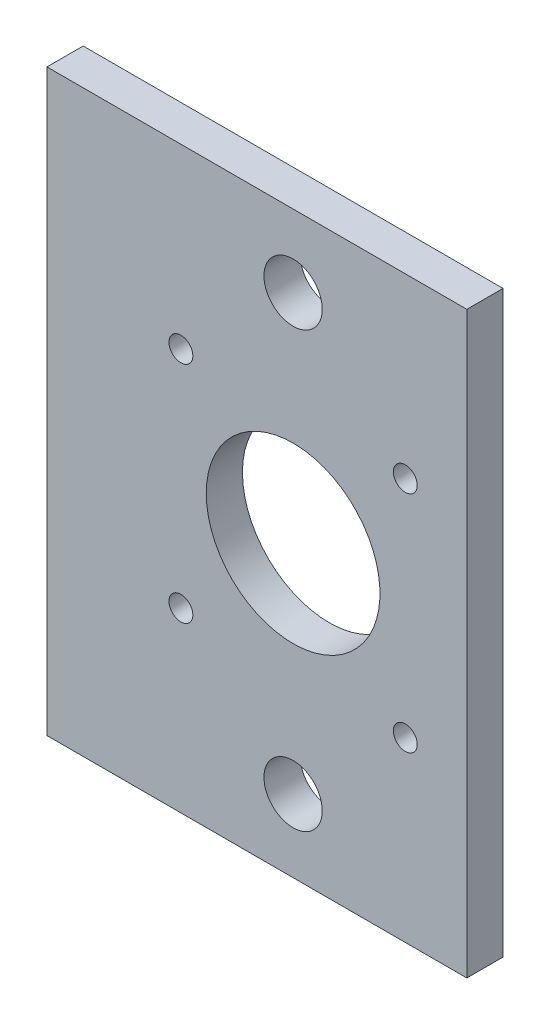
ISO-10303-21;
HEADER;
FILE_DESCRIPTION(('STEP AP214'),'2;1');
FILE_NAME('part.step','',(''),(''),'','','');
FILE_SCHEMA(('AUTOMOTIVE_DESIGN { 1 0 10303 214 1 1 1 1 }'));
ENDSEC;
DATA;
#1=APPLICATION_CONTEXT('core data for automotive mechanical design processes');
#2=APPLICATION_PROTOCOL_DEFINITION('international standard','automotive_design',2000,#1);
#3=PRODUCT_CONTEXT('',#1,'mechanical');
#4=PRODUCT('Part','Part','',(#3));
#5=PRODUCT_RELATED_PRODUCT_CATEGORY('part','',(#4));
#6=PRODUCT_DEFINITION_FORMATION('','',#4);
#7=PRODUCT_DEFINITION_CONTEXT('part definition',#1,'design');
#8=PRODUCT_DEFINITION('design','',#6,#7);
#9=PRODUCT_DEFINITION_SHAPE('','',#8);
#10=(LENGTH_UNIT() NAMED_UNIT(*) SI_UNIT(.MILLI.,.METRE.));
#11=(NAMED_UNIT(*) PLANE_ANGLE_UNIT() SI_UNIT($,.RADIAN.));
#12=(NAMED_UNIT(*) SI_UNIT($,.STERADIAN.) SOLID_ANGLE_UNIT());
#13=UNCERTAINTY_MEASURE_WITH_UNIT(LENGTH_MEASURE(1.E-05),#10,'distance_accuracy_value','');
#14=(GEOMETRIC_REPRESENTATION_CONTEXT(3) GLOBAL_UNCERTAINTY_ASSIGNED_CONTEXT((#13)) GLOBAL_UNIT_ASSIGNED_CONTEXT((#10,
#11,#12)) REPRESENTATION_CONTEXT('',''));
#15=CARTESIAN_POINT('',(0.,0.,0.));
#16=DIRECTION('',(0.,0.,1.));
#17=DIRECTION('',(1.,0.,0.));
#18=AXIS2_PLACEMENT_3D('',#15,#16,#17);
#19=CARTESIAN_POINT('',(-32.75,-40.,5.));
#20=DIRECTION('',(1.,0.,0.));
#21=DIRECTION('',(0.,0.,-1.));
#22=AXIS2_PLACEMENT_3D('',#19,#20,#21);
#23=PLANE('',#22);
#24=DIRECTION('',(0.,-1.,0.));
#25=VECTOR('',#24,1.);
#26=CARTESIAN_POINT('',(-32.75,-40.,0.));
#27=LINE('',#26,#25);
#28=CARTESIAN_POINT('',(-32.75,40.,0.));
#29=VERTEX_POINT('',#28);
#30=CARTESIAN_POINT('',(-32.75,-40.,0.));
#31=VERTEX_POINT('',#30);
#32=EDGE_CURVE('E92',#29,#31,#27,.T.);
#33=ORIENTED_EDGE('',*,*,#32,.T.);
#34=DIRECTION('',(0.,0.,-1.));
#35=VECTOR('',#34,1.);
#36=CARTESIAN_POINT('',(-32.75,-40.,5.));
#37=LINE('',#36,#35);
#38=CARTESIAN_POINT('',(-32.75,-40.,5.));
#39=VERTEX_POINT('',#38);
#40=EDGE_CURVE('E11',#39,#31,#37,.T.);
#41=ORIENTED_EDGE('',*,*,#40,.F.);
#42=DIRECTION('',(0.,-1.,0.));
#43=VECTOR('',#42,1.);
#44=CARTESIAN_POINT('',(-32.75,-40.,5.));
#45=LINE('',#44,#43);
#46=CARTESIAN_POINT('',(-32.75,40.,5.));
#47=VERTEX_POINT('',#46);
#48=EDGE_CURVE('E86',#47,#39,#45,.T.);
#49=ORIENTED_EDGE('',*,*,#48,.F.);
#50=DIRECTION('',(0.,0.,-1.));
#51=VECTOR('',#50,1.);
#52=CARTESIAN_POINT('',(-32.75,40.,5.));
#53=LINE('',#52,#51);
#54=EDGE_CURVE('E47',#47,#29,#53,.T.);
#55=ORIENTED_EDGE('',*,*,#54,.T.);
#56=EDGE_LOOP('',(#33,#41,#49,#55));
#57=FACE_BOUND('',#56,.T.);
#58=ADVANCED_FACE('F39',(#57),#23,.F.);
#59=CARTESIAN_POINT('',(32.75,-40.,5.));
#60=DIRECTION('',(0.,1.,0.));
#61=DIRECTION('',(-1.,0.,0.));
#62=AXIS2_PLACEMENT_3D('',#59,#60,#61);
#63=PLANE('',#62);
#64=DIRECTION('',(1.,0.,0.));
#65=VECTOR('',#64,1.);
#66=CARTESIAN_POINT('',(32.75,-40.,0.));
#67=LINE('',#66,#65);
#68=CARTESIAN_POINT('',(25.2500003090974,-40.,0.));
#69=VERTEX_POINT('',#68);
#70=EDGE_CURVE('E87',#31,#69,#67,.T.);
#71=ORIENTED_EDGE('',*,*,#70,.T.);
#72=DIRECTION('',(0.,0.,1.));
#73=VECTOR('',#72,1.);
#74=CARTESIAN_POINT('',(25.2500003090974,-40.,0.));
#75=LINE('',#74,#73);
#76=CARTESIAN_POINT('',(25.2500003090974,-40.,5.));
#77=VERTEX_POINT('',#76);
#78=EDGE_CURVE('E55',#69,#77,#75,.T.);
#79=ORIENTED_EDGE('',*,*,#78,.T.);
#80=DIRECTION('',(1.,0.,0.));
#81=VECTOR('',#80,1.);
#82=CARTESIAN_POINT('',(32.75,-40.,5.));
#83=LINE('',#82,#81);
#84=EDGE_CURVE('E150',#39,#77,#83,.T.);
#85=ORIENTED_EDGE('',*,*,#84,.F.);
#86=ORIENTED_EDGE('',*,*,#40,.T.);
#87=EDGE_LOOP('',(#71,#79,#85,#86));
#88=FACE_BOUND('',#87,.T.);
#89=ADVANCED_FACE('F156',(#88),#63,.F.);
#90=CARTESIAN_POINT('',(32.75,40.,5.));
#91=DIRECTION('',(0.,-1.,0.));
#92=DIRECTION('',(1.,0.,0.));
#93=AXIS2_PLACEMENT_3D('',#90,#91,#92);
#94=PLANE('',#93);
#95=DIRECTION('',(-1.,0.,0.));
#96=VECTOR('',#95,1.);
#97=CARTESIAN_POINT('',(32.75,40.,5.));
#98=LINE('',#97,#96);
#99=CARTESIAN_POINT('',(25.2500003090974,40.,5.));
#100=VERTEX_POINT('',#99);
#101=EDGE_CURVE('E64',#100,#47,#98,.T.);
#102=ORIENTED_EDGE('',*,*,#101,.F.);
#103=DIRECTION('',(0.,0.,1.));
#104=VECTOR('',#103,1.);
#105=CARTESIAN_POINT('',(25.2500003090974,40.,0.));
#106=LINE('',#105,#104);
#107=CARTESIAN_POINT('',(25.2500003090974,40.,0.));
#108=VERTEX_POINT('',#107);
#109=EDGE_CURVE('E83',#108,#100,#106,.T.);
#110=ORIENTED_EDGE('',*,*,#109,.F.);
#111=DIRECTION('',(-1.,0.,0.));
#112=VECTOR('',#111,1.);
#113=CARTESIAN_POINT('',(32.75,40.,0.));
#114=LINE('',#113,#112);
#115=EDGE_CURVE('E78',#108,#29,#114,.T.);
#116=ORIENTED_EDGE('',*,*,#115,.T.);
#117=ORIENTED_EDGE('',*,*,#54,.F.);
#118=EDGE_LOOP('',(#102,#110,#116,#117));
#119=FACE_BOUND('',#118,.T.);
#120=ADVANCED_FACE('F80',(#119),#94,.F.);
#121=CARTESIAN_POINT('',(0.,0.,5.));
#122=DIRECTION('',(0.,0.,1.));
#123=DIRECTION('',(1.,0.,0.));
#124=AXIS2_PLACEMENT_3D('',#121,#122,#123);
#125=PLANE('',#124);
#126=CARTESIAN_POINT('',(1.24999999999664,29.9999999999987,5.));
#127=DIRECTION('',(0.,0.,-1.));
#128=DIRECTION('',(-1.,0.,0.));
#129=AXIS2_PLACEMENT_3D('',#126,#127,#128);
#130=CIRCLE('',#129,4.025);
#131=CARTESIAN_POINT('',(-2.77500000000336,29.9999999999987,5.));
#132=VERTEX_POINT('',#131);
#133=EDGE_CURVE('E103',#132,#132,#130,.T.);
#134=ORIENTED_EDGE('',*,*,#133,.T.);
#135=EDGE_LOOP('',(#134));
#136=FACE_BOUND('',#135,.T.);
#137=CARTESIAN_POINT('',(1.24999999999664,-29.9999999999987,5.));
#138=DIRECTION('',(0.,0.,-1.));
#139=DIRECTION('',(1.,0.,0.));
#140=AXIS2_PLACEMENT_3D('',#137,#138,#139);
#141=CIRCLE('',#140,4.025);
#142=CARTESIAN_POINT('',(5.27499999999664,-29.9999999999987,5.));
#143=VERTEX_POINT('',#142);
#144=EDGE_CURVE('E109',#143,#143,#141,.T.);
#145=ORIENTED_EDGE('',*,*,#144,.T.);
#146=EDGE_LOOP('',(#145));
#147=FACE_BOUND('',#146,.T.);
#148=CARTESIAN_POINT('',(16.7499999999879,-15.4999999999983,5.));
#149=DIRECTION('',(0.,0.,-1.));
#150=DIRECTION('',(-1.,0.,0.));
#151=AXIS2_PLACEMENT_3D('',#148,#149,#150);
#152=CIRCLE('',#151,1.65000000000618);
#153=CARTESIAN_POINT('',(15.0999999999818,-15.4999999999983,5.));
#154=VERTEX_POINT('',#153);
#155=EDGE_CURVE('E107',#154,#154,#152,.T.);
#156=ORIENTED_EDGE('',*,*,#155,.T.);
#157=EDGE_LOOP('',(#156));
#158=FACE_BOUND('',#157,.T.);
#159=CARTESIAN_POINT('',(-14.2500000000121,-15.4999999999985,5.));
#160=DIRECTION('',(0.,0.,-1.));
#161=DIRECTION('',(-1.,0.,0.));
#162=AXIS2_PLACEMENT_3D('',#159,#160,#161);
#163=CIRCLE('',#162,1.65000000000618);
#164=CARTESIAN_POINT('',(-15.9000000000182,-15.4999999999985,5.));
#165=VERTEX_POINT('',#164);
#166=EDGE_CURVE('E132',#165,#165,#163,.T.);
#167=ORIENTED_EDGE('',*,*,#166,.T.);
#168=EDGE_LOOP('',(#167));
#169=FACE_BOUND('',#168,.T.);
#170=CARTESIAN_POINT('',(-14.2500000000123,15.5000000000015,5.));
#171=DIRECTION('',(0.,0.,-1.));
#172=DIRECTION('',(-1.,0.,0.));
#173=AXIS2_PLACEMENT_3D('',#170,#171,#172);
#174=CIRCLE('',#173,1.65000000000618);
#175=CARTESIAN_POINT('',(-15.9000000000185,15.5000000000015,5.));
#176=VERTEX_POINT('',#175);
#177=EDGE_CURVE('E126',#176,#176,#174,.T.);
#178=ORIENTED_EDGE('',*,*,#177,.T.);
#179=EDGE_LOOP('',(#178));
#180=FACE_BOUND('',#179,.T.);
#181=CARTESIAN_POINT('',(16.7499999999877,15.5000000000017,5.));
#182=DIRECTION('',(0.,0.,-1.));
#183=DIRECTION('',(-1.,0.,0.));
#184=AXIS2_PLACEMENT_3D('',#181,#182,#183);
#185=CIRCLE('',#184,1.65000000000618);
#186=CARTESIAN_POINT('',(15.0999999999815,15.5000000000017,5.));
#187=VERTEX_POINT('',#186);
#188=EDGE_CURVE('E120',#187,#187,#185,.T.);
#189=ORIENTED_EDGE('',*,*,#188,.T.);
#190=EDGE_LOOP('',(#189));
#191=FACE_BOUND('',#190,.T.);
#192=CARTESIAN_POINT('',(1.24999999998793,1.55431223447522E-12,5.));
#193=DIRECTION('',(0.,0.,-1.));
#194=DIRECTION('',(-1.,0.,0.));
#195=AXIS2_PLACEMENT_3D('',#192,#193,#194);
#196=CIRCLE('',#195,12.0000000000062);
#197=CARTESIAN_POINT('',(-10.7500000000183,1.55431223447522E-12,5.));
#198=VERTEX_POINT('',#197);
#199=EDGE_CURVE('E140',#198,#198,#196,.T.);
#200=ORIENTED_EDGE('',*,*,#199,.T.);
#201=EDGE_LOOP('',(#200));
#202=FACE_BOUND('',#201,.T.);
#203=DIRECTION('',(0.,-1.,0.));
#204=VECTOR('',#203,1.);
#205=CARTESIAN_POINT('',(25.2500003090974,-40.,5.));
#206=LINE('',#205,#204);
#207=EDGE_CURVE('E143',#100,#77,#206,.T.);
#208=ORIENTED_EDGE('',*,*,#207,.F.);
#209=ORIENTED_EDGE('',*,*,#101,.T.);
#210=ORIENTED_EDGE('',*,*,#48,.T.);
#211=ORIENTED_EDGE('',*,*,#84,.T.);
#212=EDGE_LOOP('',(#208,#209,#210,#211));
#213=FACE_BOUND('',#212,.T.);
#214=ADVANCED_FACE('F153',(#136,#147,#158,#169,#180,#191,#202,#213),#125,.T.);
#215=CARTESIAN_POINT('',(0.,0.,0.));
#216=DIRECTION('',(0.,0.,1.));
#217=DIRECTION('',(1.,0.,0.));
#218=AXIS2_PLACEMENT_3D('',#215,#216,#217);
#219=PLANE('',#218);
#220=CARTESIAN_POINT('',(1.24999999999664,29.9999999999987,0.));
#221=DIRECTION('',(0.,0.,1.));
#222=DIRECTION('',(1.,0.,0.));
#223=AXIS2_PLACEMENT_3D('',#220,#221,#222);
#224=CIRCLE('',#223,4.025);
#225=CARTESIAN_POINT('',(5.27499999999664,29.9999999999987,0.));
#226=VERTEX_POINT('',#225);
#227=EDGE_CURVE('E42',#226,#226,#224,.T.);
#228=ORIENTED_EDGE('',*,*,#227,.T.);
#229=EDGE_LOOP('',(#228));
#230=FACE_BOUND('',#229,.T.);
#231=CARTESIAN_POINT('',(1.24999999999664,-29.9999999999987,0.));
#232=DIRECTION('',(0.,0.,1.));
#233=DIRECTION('',(1.,0.,0.));
#234=AXIS2_PLACEMENT_3D('',#231,#232,#233);
#235=CIRCLE('',#234,4.025);
#236=CARTESIAN_POINT('',(5.27499999999664,-29.9999999999987,0.));
#237=VERTEX_POINT('',#236);
#238=EDGE_CURVE('E101',#237,#237,#235,.T.);
#239=ORIENTED_EDGE('',*,*,#238,.T.);
#240=EDGE_LOOP('',(#239));
#241=FACE_BOUND('',#240,.T.);
#242=CARTESIAN_POINT('',(16.7499999999879,-15.4999999999983,0.));
#243=DIRECTION('',(0.,0.,-1.));
#244=DIRECTION('',(-1.,0.,0.));
#245=AXIS2_PLACEMENT_3D('',#242,#243,#244);
#246=CIRCLE('',#245,1.65000000000618);
#247=CARTESIAN_POINT('',(15.0999999999818,-15.4999999999983,0.));
#248=VERTEX_POINT('',#247);
#249=EDGE_CURVE('E135',#248,#248,#246,.T.);
#250=ORIENTED_EDGE('',*,*,#249,.F.);
#251=EDGE_LOOP('',(#250));
#252=FACE_BOUND('',#251,.T.);
#253=CARTESIAN_POINT('',(-14.2500000000121,-15.4999999999985,0.));
#254=DIRECTION('',(0.,0.,-1.));
#255=DIRECTION('',(-1.,0.,0.));
#256=AXIS2_PLACEMENT_3D('',#253,#254,#255);
#257=CIRCLE('',#256,1.65000000000618);
#258=CARTESIAN_POINT('',(-15.9000000000182,-15.4999999999985,0.));
#259=VERTEX_POINT('',#258);
#260=EDGE_CURVE('E129',#259,#259,#257,.T.);
#261=ORIENTED_EDGE('',*,*,#260,.F.);
#262=EDGE_LOOP('',(#261));
#263=FACE_BOUND('',#262,.T.);
#264=CARTESIAN_POINT('',(-14.2500000000123,15.5000000000015,0.));
#265=DIRECTION('',(0.,0.,-1.));
#266=DIRECTION('',(-1.,0.,0.));
#267=AXIS2_PLACEMENT_3D('',#264,#265,#266);
#268=CIRCLE('',#267,1.65000000000618);
#269=CARTESIAN_POINT('',(-15.9000000000185,15.5000000000015,0.));
#270=VERTEX_POINT('',#269);
#271=EDGE_CURVE('E123',#270,#270,#268,.T.);
#272=ORIENTED_EDGE('',*,*,#271,.F.);
#273=EDGE_LOOP('',(#272));
#274=FACE_BOUND('',#273,.T.);
#275=CARTESIAN_POINT('',(16.7499999999877,15.5000000000017,0.));
#276=DIRECTION('',(0.,0.,-1.));
#277=DIRECTION('',(-1.,0.,0.));
#278=AXIS2_PLACEMENT_3D('',#275,#276,#277);
#279=CIRCLE('',#278,1.65000000000618);
#280=CARTESIAN_POINT('',(15.0999999999815,15.5000000000017,0.));
#281=VERTEX_POINT('',#280);
#282=EDGE_CURVE('E116',#281,#281,#279,.T.);
#283=ORIENTED_EDGE('',*,*,#282,.F.);
#284=EDGE_LOOP('',(#283));
#285=FACE_BOUND('',#284,.T.);
#286=CARTESIAN_POINT('',(1.24999999998793,1.55431223447522E-12,0.));
#287=DIRECTION('',(0.,0.,-1.));
#288=DIRECTION('',(-1.,0.,0.));
#289=AXIS2_PLACEMENT_3D('',#286,#287,#288);
#290=CIRCLE('',#289,12.0000000000062);
#291=CARTESIAN_POINT('',(-10.7500000000183,1.55431223447522E-12,0.));
#292=VERTEX_POINT('',#291);
#293=EDGE_CURVE('E119',#292,#292,#290,.T.);
#294=ORIENTED_EDGE('',*,*,#293,.F.);
#295=EDGE_LOOP('',(#294));
#296=FACE_BOUND('',#295,.T.);
#297=ORIENTED_EDGE('',*,*,#115,.F.);
#298=DIRECTION('',(0.,-1.,0.));
#299=VECTOR('',#298,1.);
#300=CARTESIAN_POINT('',(25.2500003090974,-40.,0.));
#301=LINE('',#300,#299);
#302=EDGE_CURVE('E146',#108,#69,#301,.T.);
#303=ORIENTED_EDGE('',*,*,#302,.T.);
#304=ORIENTED_EDGE('',*,*,#70,.F.);
#305=ORIENTED_EDGE('',*,*,#32,.F.);
#306=EDGE_LOOP('',(#297,#303,#304,#305));
#307=FACE_BOUND('',#306,.T.);
#308=ADVANCED_FACE('F94',(#230,#241,#252,#263,#274,#285,#296,#307),#219,.F.);
#309=CARTESIAN_POINT('',(25.2500003090974,-40.,0.));
#310=DIRECTION('',(-1.,0.,0.));
#311=DIRECTION('',(0.,0.,1.));
#312=AXIS2_PLACEMENT_3D('',#309,#310,#311);
#313=PLANE('',#312);
#314=ORIENTED_EDGE('',*,*,#207,.T.);
#315=ORIENTED_EDGE('',*,*,#78,.F.);
#316=ORIENTED_EDGE('',*,*,#302,.F.);
#317=ORIENTED_EDGE('',*,*,#109,.T.);
#318=EDGE_LOOP('',(#314,#315,#316,#317));
#319=FACE_BOUND('',#318,.T.);
#320=ADVANCED_FACE('F166',(#319),#313,.F.);
#321=CARTESIAN_POINT('',(1.24999999998793,1.55431223447522E-12,5.));
#322=DIRECTION('',(0.,0.,-1.));
#323=DIRECTION('',(-1.,0.,0.));
#324=AXIS2_PLACEMENT_3D('',#321,#322,#323);
#325=CYLINDRICAL_SURFACE('',#324,12.0000000000062);
#326=ORIENTED_EDGE('',*,*,#199,.F.);
#327=EDGE_LOOP('',(#326));
#328=FACE_BOUND('',#327,.T.);
#329=ORIENTED_EDGE('',*,*,#293,.T.);
#330=EDGE_LOOP('',(#329));
#331=FACE_BOUND('',#330,.T.);
#332=ADVANCED_FACE('F172',(#328,#331),#325,.F.);
#333=CARTESIAN_POINT('',(16.7499999999877,15.5000000000017,5.));
#334=DIRECTION('',(0.,0.,-1.));
#335=DIRECTION('',(-1.,0.,0.));
#336=AXIS2_PLACEMENT_3D('',#333,#334,#335);
#337=CYLINDRICAL_SURFACE('',#336,1.65000000000618);
#338=ORIENTED_EDGE('',*,*,#188,.F.);
#339=EDGE_LOOP('',(#338));
#340=FACE_BOUND('',#339,.T.);
#341=ORIENTED_EDGE('',*,*,#282,.T.);
#342=EDGE_LOOP('',(#341));
#343=FACE_BOUND('',#342,.T.);
#344=ADVANCED_FACE('F175',(#340,#343),#337,.F.);
#345=CARTESIAN_POINT('',(-14.2500000000123,15.5000000000015,5.));
#346=DIRECTION('',(0.,0.,-1.));
#347=DIRECTION('',(-1.,0.,0.));
#348=AXIS2_PLACEMENT_3D('',#345,#346,#347);
#349=CYLINDRICAL_SURFACE('',#348,1.65000000000618);
#350=ORIENTED_EDGE('',*,*,#177,.F.);
#351=EDGE_LOOP('',(#350));
#352=FACE_BOUND('',#351,.T.);
#353=ORIENTED_EDGE('',*,*,#271,.T.);
#354=EDGE_LOOP('',(#353));
#355=FACE_BOUND('',#354,.T.);
#356=ADVANCED_FACE('F185',(#352,#355),#349,.F.);
#357=CARTESIAN_POINT('',(-14.2500000000121,-15.4999999999985,5.));
#358=DIRECTION('',(0.,0.,-1.));
#359=DIRECTION('',(-1.,0.,0.));
#360=AXIS2_PLACEMENT_3D('',#357,#358,#359);
#361=CYLINDRICAL_SURFACE('',#360,1.65000000000618);
#362=ORIENTED_EDGE('',*,*,#166,.F.);
#363=EDGE_LOOP('',(#362));
#364=FACE_BOUND('',#363,.T.);
#365=ORIENTED_EDGE('',*,*,#260,.T.);
#366=EDGE_LOOP('',(#365));
#367=FACE_BOUND('',#366,.T.);
#368=ADVANCED_FACE('F181',(#364,#367),#361,.F.);
#369=CARTESIAN_POINT('',(16.7499999999879,-15.4999999999983,5.));
#370=DIRECTION('',(0.,0.,-1.));
#371=DIRECTION('',(-1.,0.,0.));
#372=AXIS2_PLACEMENT_3D('',#369,#370,#371);
#373=CYLINDRICAL_SURFACE('',#372,1.65000000000618);
#374=ORIENTED_EDGE('',*,*,#155,.F.);
#375=EDGE_LOOP('',(#374));
#376=FACE_BOUND('',#375,.T.);
#377=ORIENTED_EDGE('',*,*,#249,.T.);
#378=EDGE_LOOP('',(#377));
#379=FACE_BOUND('',#378,.T.);
#380=ADVANCED_FACE('F177',(#376,#379),#373,.F.);
#381=CARTESIAN_POINT('',(1.24999999999664,-29.9999999999987,5.));
#382=DIRECTION('',(0.,0.,-1.));
#383=DIRECTION('',(-1.,0.,0.));
#384=AXIS2_PLACEMENT_3D('',#381,#382,#383);
#385=CYLINDRICAL_SURFACE('',#384,4.025);
#386=ORIENTED_EDGE('',*,*,#144,.F.);
#387=EDGE_LOOP('',(#386));
#388=FACE_BOUND('',#387,.T.);
#389=ORIENTED_EDGE('',*,*,#238,.F.);
#390=EDGE_LOOP('',(#389));
#391=FACE_BOUND('',#390,.T.);
#392=ADVANCED_FACE('F180',(#388,#391),#385,.F.);
#393=CARTESIAN_POINT('',(1.24999999999664,29.9999999999987,5.));
#394=DIRECTION('',(0.,0.,-1.));
#395=DIRECTION('',(-1.,0.,0.));
#396=AXIS2_PLACEMENT_3D('',#393,#394,#395);
#397=CYLINDRICAL_SURFACE('',#396,4.025);
#398=ORIENTED_EDGE('',*,*,#133,.F.);
#399=EDGE_LOOP('',(#398));
#400=FACE_BOUND('',#399,.T.);
#401=ORIENTED_EDGE('',*,*,#227,.F.);
#402=EDGE_LOOP('',(#401));
#403=FACE_BOUND('',#402,.T.);
#404=ADVANCED_FACE('F195',(#400,#403),#397,.F.);
#405=CLOSED_SHELL('',(#58,#89,#120,#214,#308,#320,#332,#344,#356,#368,#380,#392,#404));
#406=MANIFOLD_SOLID_BREP('B2',#405);
#407=ADVANCED_BREP_SHAPE_REPRESENTATION('',(#18,#406),#14);
#408=SHAPE_DEFINITION_REPRESENTATION(#9,#407);
ENDSEC;
END-ISO-10303-21;
